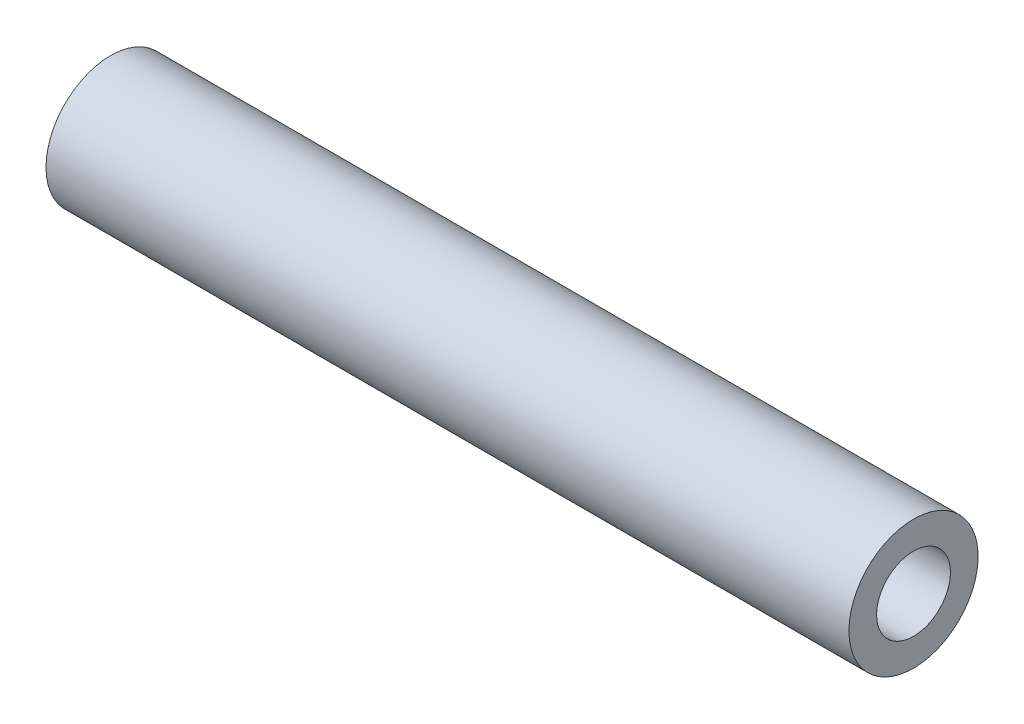
ISO-10303-21;
HEADER;
FILE_DESCRIPTION(('STEP AP214'),'2;1');
FILE_NAME('part.step','',(''),(''),'','','');
FILE_SCHEMA(('AUTOMOTIVE_DESIGN { 1 0 10303 214 1 1 1 1 }'));
ENDSEC;
DATA;
#1=APPLICATION_CONTEXT('core data for automotive mechanical design processes');
#2=APPLICATION_PROTOCOL_DEFINITION('international standard','automotive_design',2000,#1);
#3=PRODUCT_CONTEXT('',#1,'mechanical');
#4=PRODUCT('Part','Part','',(#3));
#5=PRODUCT_RELATED_PRODUCT_CATEGORY('part','',(#4));
#6=PRODUCT_DEFINITION_FORMATION('','',#4);
#7=PRODUCT_DEFINITION_CONTEXT('part definition',#1,'design');
#8=PRODUCT_DEFINITION('design','',#6,#7);
#9=PRODUCT_DEFINITION_SHAPE('','',#8);
#10=(LENGTH_UNIT() NAMED_UNIT(*) SI_UNIT(.MILLI.,.METRE.));
#11=(NAMED_UNIT(*) PLANE_ANGLE_UNIT() SI_UNIT($,.RADIAN.));
#12=(NAMED_UNIT(*) SI_UNIT($,.STERADIAN.) SOLID_ANGLE_UNIT());
#13=UNCERTAINTY_MEASURE_WITH_UNIT(LENGTH_MEASURE(1.E-05),#10,'distance_accuracy_value','');
#14=(GEOMETRIC_REPRESENTATION_CONTEXT(3) GLOBAL_UNCERTAINTY_ASSIGNED_CONTEXT((#13)) GLOBAL_UNIT_ASSIGNED_CONTEXT((#10,
#11,#12)) REPRESENTATION_CONTEXT('',''));
#15=CARTESIAN_POINT('',(0.,0.,0.));
#16=DIRECTION('',(0.,0.,1.));
#17=DIRECTION('',(1.,0.,0.));
#18=AXIS2_PLACEMENT_3D('',#15,#16,#17);
#19=CARTESIAN_POINT('',(-43.5,7.,0.));
#20=DIRECTION('',(1.,0.,0.));
#21=DIRECTION('',(0.,0.,-1.));
#22=AXIS2_PLACEMENT_3D('',#19,#20,#21);
#23=PLANE('',#22);
#24=CARTESIAN_POINT('',(-43.5,0.,0.));
#25=DIRECTION('',(-1.,0.,0.));
#26=DIRECTION('',(0.,0.,1.));
#27=AXIS2_PLACEMENT_3D('',#24,#25,#26);
#28=CIRCLE('',#27,4.);
#29=CARTESIAN_POINT('',(-43.5,0.,4.));
#30=VERTEX_POINT('',#29);
#31=EDGE_CURVE('E10',#30,#30,#28,.T.);
#32=ORIENTED_EDGE('',*,*,#31,.F.);
#33=EDGE_LOOP('',(#32));
#34=FACE_BOUND('',#33,.T.);
#35=CARTESIAN_POINT('',(-43.5,0.,0.));
#36=DIRECTION('',(-1.,0.,0.));
#37=DIRECTION('',(0.,0.,1.));
#38=AXIS2_PLACEMENT_3D('',#35,#36,#37);
#39=CIRCLE('',#38,7.);
#40=CARTESIAN_POINT('',(-43.5,0.,7.));
#41=VERTEX_POINT('',#40);
#42=EDGE_CURVE('E44',#41,#41,#39,.T.);
#43=ORIENTED_EDGE('',*,*,#42,.T.);
#44=EDGE_LOOP('',(#43));
#45=FACE_BOUND('',#44,.T.);
#46=ADVANCED_FACE('F30',(#34,#45),#23,.F.);
#47=CARTESIAN_POINT('',(0.,0.,0.));
#48=DIRECTION('',(-1.,0.,0.));
#49=DIRECTION('',(0.,0.,1.));
#50=AXIS2_PLACEMENT_3D('',#47,#48,#49);
#51=CYLINDRICAL_SURFACE('',#50,4.);
#52=CARTESIAN_POINT('',(43.5,0.,0.));
#53=DIRECTION('',(-1.,0.,0.));
#54=DIRECTION('',(0.,0.,1.));
#55=AXIS2_PLACEMENT_3D('',#52,#53,#54);
#56=CIRCLE('',#55,4.);
#57=CARTESIAN_POINT('',(43.5,0.,4.));
#58=VERTEX_POINT('',#57);
#59=EDGE_CURVE('E36',#58,#58,#56,.T.);
#60=ORIENTED_EDGE('',*,*,#59,.F.);
#61=EDGE_LOOP('',(#60));
#62=FACE_BOUND('',#61,.T.);
#63=ORIENTED_EDGE('',*,*,#31,.T.);
#64=EDGE_LOOP('',(#63));
#65=FACE_BOUND('',#64,.T.);
#66=ADVANCED_FACE('F59',(#62,#65),#51,.F.);
#67=CARTESIAN_POINT('',(43.5,7.,0.));
#68=DIRECTION('',(-1.,0.,0.));
#69=DIRECTION('',(0.,0.,1.));
#70=AXIS2_PLACEMENT_3D('',#67,#68,#69);
#71=PLANE('',#70);
#72=CARTESIAN_POINT('',(43.5,0.,0.));
#73=DIRECTION('',(-1.,0.,0.));
#74=DIRECTION('',(0.,0.,1.));
#75=AXIS2_PLACEMENT_3D('',#72,#73,#74);
#76=CIRCLE('',#75,7.);
#77=CARTESIAN_POINT('',(43.5,0.,7.));
#78=VERTEX_POINT('',#77);
#79=EDGE_CURVE('E40',#78,#78,#76,.T.);
#80=ORIENTED_EDGE('',*,*,#79,.F.);
#81=EDGE_LOOP('',(#80));
#82=FACE_BOUND('',#81,.T.);
#83=ORIENTED_EDGE('',*,*,#59,.T.);
#84=EDGE_LOOP('',(#83));
#85=FACE_BOUND('',#84,.T.);
#86=ADVANCED_FACE('F54',(#82,#85),#71,.F.);
#87=CARTESIAN_POINT('',(0.,0.,0.));
#88=DIRECTION('',(-1.,0.,0.));
#89=DIRECTION('',(0.,0.,1.));
#90=AXIS2_PLACEMENT_3D('',#87,#88,#89);
#91=CYLINDRICAL_SURFACE('',#90,7.);
#92=ORIENTED_EDGE('',*,*,#42,.F.);
#93=EDGE_LOOP('',(#92));
#94=FACE_BOUND('',#93,.T.);
#95=ORIENTED_EDGE('',*,*,#79,.T.);
#96=EDGE_LOOP('',(#95));
#97=FACE_BOUND('',#96,.T.);
#98=ADVANCED_FACE('F51',(#94,#97),#91,.T.);
#99=CLOSED_SHELL('',(#46,#66,#86,#98));
#100=MANIFOLD_SOLID_BREP('B2',#99);
#101=ADVANCED_BREP_SHAPE_REPRESENTATION('',(#18,#100),#14);
#102=SHAPE_DEFINITION_REPRESENTATION(#9,#101);
ENDSEC;
END-ISO-10303-21;
